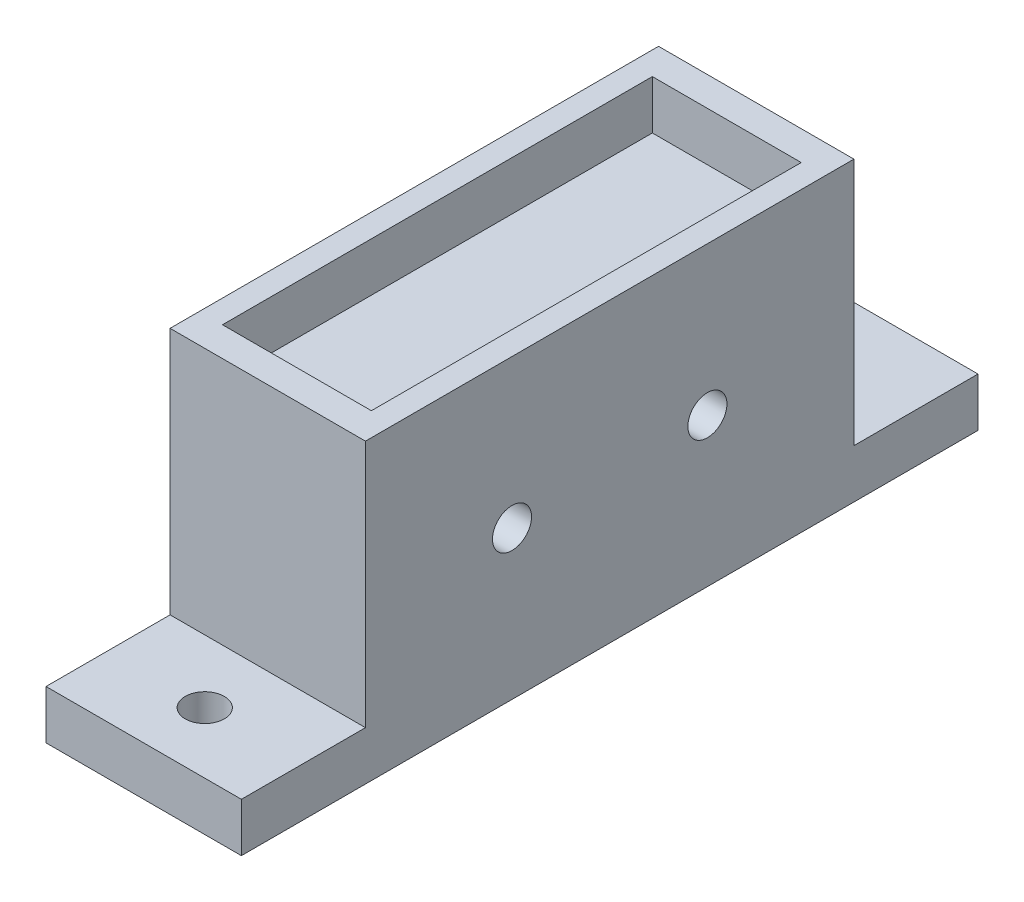
ISO-10303-21;
HEADER;
FILE_DESCRIPTION(('STEP AP214'),'2;1');
FILE_NAME('part.step','',(''),(''),'','','');
FILE_SCHEMA(('AUTOMOTIVE_DESIGN { 1 0 10303 214 1 1 1 1 }'));
ENDSEC;
DATA;
#1=APPLICATION_CONTEXT('core data for automotive mechanical design processes');
#2=APPLICATION_PROTOCOL_DEFINITION('international standard','automotive_design',2000,#1);
#3=PRODUCT_CONTEXT('',#1,'mechanical');
#4=PRODUCT('Part','Part','',(#3));
#5=PRODUCT_RELATED_PRODUCT_CATEGORY('part','',(#4));
#6=PRODUCT_DEFINITION_FORMATION('','',#4);
#7=PRODUCT_DEFINITION_CONTEXT('part definition',#1,'design');
#8=PRODUCT_DEFINITION('design','',#6,#7);
#9=PRODUCT_DEFINITION_SHAPE('','',#8);
#10=(LENGTH_UNIT() NAMED_UNIT(*) SI_UNIT(.MILLI.,.METRE.));
#11=(NAMED_UNIT(*) PLANE_ANGLE_UNIT() SI_UNIT($,.RADIAN.));
#12=(NAMED_UNIT(*) SI_UNIT($,.STERADIAN.) SOLID_ANGLE_UNIT());
#13=UNCERTAINTY_MEASURE_WITH_UNIT(LENGTH_MEASURE(1.E-05),#10,'distance_accuracy_value','');
#14=(GEOMETRIC_REPRESENTATION_CONTEXT(3) GLOBAL_UNCERTAINTY_ASSIGNED_CONTEXT((#13)) GLOBAL_UNIT_ASSIGNED_CONTEXT((#10,
#11,#12)) REPRESENTATION_CONTEXT('',''));
#15=CARTESIAN_POINT('',(0.,0.,0.));
#16=DIRECTION('',(0.,0.,1.));
#17=DIRECTION('',(1.,0.,0.));
#18=AXIS2_PLACEMENT_3D('',#15,#16,#17);
#19=CARTESIAN_POINT('',(20.,0.,-75.4));
#20=DIRECTION('',(0.,1.,0.));
#21=DIRECTION('',(0.,0.,1.));
#22=AXIS2_PLACEMENT_3D('',#19,#20,#21);
#23=PLANE('',#22);
#24=CARTESIAN_POINT('',(10.,0.,-69.15));
#25=DIRECTION('',(0.,1.,0.));
#26=DIRECTION('',(0.,0.,1.));
#27=AXIS2_PLACEMENT_3D('',#24,#25,#26);
#28=CIRCLE('',#27,2.);
#29=CARTESIAN_POINT('',(10.,0.,-67.15));
#30=VERTEX_POINT('',#29);
#31=EDGE_CURVE('E184',#30,#30,#28,.T.);
#32=ORIENTED_EDGE('',*,*,#31,.T.);
#33=EDGE_LOOP('',(#32));
#34=FACE_BOUND('',#33,.T.);
#35=CARTESIAN_POINT('',(10.,0.,-6.25000000000001));
#36=DIRECTION('',(0.,1.,0.));
#37=DIRECTION('',(0.,0.,1.));
#38=AXIS2_PLACEMENT_3D('',#35,#36,#37);
#39=CIRCLE('',#38,2.);
#40=CARTESIAN_POINT('',(10.,0.,-4.25000000000001));
#41=VERTEX_POINT('',#40);
#42=EDGE_CURVE('E190',#41,#41,#39,.T.);
#43=ORIENTED_EDGE('',*,*,#42,.T.);
#44=EDGE_LOOP('',(#43));
#45=FACE_BOUND('',#44,.T.);
#46=DIRECTION('',(0.,0.,-1.));
#47=VECTOR('',#46,1.);
#48=CARTESIAN_POINT('',(0.,0.,-75.4));
#49=LINE('',#48,#47);
#50=CARTESIAN_POINT('',(0.,0.,0.));
#51=VERTEX_POINT('',#50);
#52=CARTESIAN_POINT('',(0.,0.,-75.4));
#53=VERTEX_POINT('',#52);
#54=EDGE_CURVE('E142',#51,#53,#49,.T.);
#55=ORIENTED_EDGE('',*,*,#54,.T.);
#56=DIRECTION('',(-1.,0.,0.));
#57=VECTOR('',#56,1.);
#58=CARTESIAN_POINT('',(20.,0.,-75.4));
#59=LINE('',#58,#57);
#60=CARTESIAN_POINT('',(20.,0.,-75.4));
#61=VERTEX_POINT('',#60);
#62=EDGE_CURVE('E11',#61,#53,#59,.T.);
#63=ORIENTED_EDGE('',*,*,#62,.F.);
#64=DIRECTION('',(0.,0.,-1.));
#65=VECTOR('',#64,1.);
#66=CARTESIAN_POINT('',(20.,0.,-75.4));
#67=LINE('',#66,#65);
#68=CARTESIAN_POINT('',(20.,0.,0.));
#69=VERTEX_POINT('',#68);
#70=EDGE_CURVE('E158',#69,#61,#67,.T.);
#71=ORIENTED_EDGE('',*,*,#70,.F.);
#72=DIRECTION('',(-1.,0.,0.));
#73=VECTOR('',#72,1.);
#74=CARTESIAN_POINT('',(20.,0.,0.));
#75=LINE('',#74,#73);
#76=EDGE_CURVE('E138',#69,#51,#75,.T.);
#77=ORIENTED_EDGE('',*,*,#76,.T.);
#78=EDGE_LOOP('',(#55,#63,#71,#77));
#79=FACE_BOUND('',#78,.T.);
#80=ADVANCED_FACE('F32',(#34,#45,#79),#23,.F.);
#81=CARTESIAN_POINT('',(20.,5.,-75.4));
#82=DIRECTION('',(0.,0.,1.));
#83=DIRECTION('',(1.,0.,0.));
#84=AXIS2_PLACEMENT_3D('',#81,#82,#83);
#85=PLANE('',#84);
#86=DIRECTION('',(0.,1.,0.));
#87=VECTOR('',#86,1.);
#88=CARTESIAN_POINT('',(0.,5.,-75.4));
#89=LINE('',#88,#87);
#90=CARTESIAN_POINT('',(0.,5.,-75.4));
#91=VERTEX_POINT('',#90);
#92=EDGE_CURVE('E145',#53,#91,#89,.T.);
#93=ORIENTED_EDGE('',*,*,#92,.T.);
#94=DIRECTION('',(-1.,0.,0.));
#95=VECTOR('',#94,1.);
#96=CARTESIAN_POINT('',(20.,5.,-75.4));
#97=LINE('',#96,#95);
#98=CARTESIAN_POINT('',(20.,5.,-75.4));
#99=VERTEX_POINT('',#98);
#100=EDGE_CURVE('E40',#99,#91,#97,.T.);
#101=ORIENTED_EDGE('',*,*,#100,.F.);
#102=DIRECTION('',(0.,1.,0.));
#103=VECTOR('',#102,1.);
#104=CARTESIAN_POINT('',(20.,5.,-75.4));
#105=LINE('',#104,#103);
#106=EDGE_CURVE('E98',#61,#99,#105,.T.);
#107=ORIENTED_EDGE('',*,*,#106,.F.);
#108=ORIENTED_EDGE('',*,*,#62,.T.);
#109=EDGE_LOOP('',(#93,#101,#107,#108));
#110=FACE_BOUND('',#109,.T.);
#111=ADVANCED_FACE('F248',(#110),#85,.F.);
#112=CARTESIAN_POINT('',(20.,5.,-62.7));
#113=DIRECTION('',(0.,-1.,0.));
#114=DIRECTION('',(0.,0.,-1.));
#115=AXIS2_PLACEMENT_3D('',#112,#113,#114);
#116=PLANE('',#115);
#117=CARTESIAN_POINT('',(10.,5.,-69.15));
#118=DIRECTION('',(0.,1.,0.));
#119=DIRECTION('',(0.,0.,1.));
#120=AXIS2_PLACEMENT_3D('',#117,#118,#119);
#121=CIRCLE('',#120,2.);
#122=CARTESIAN_POINT('',(10.,5.,-67.15));
#123=VERTEX_POINT('',#122);
#124=EDGE_CURVE('E187',#123,#123,#121,.T.);
#125=ORIENTED_EDGE('',*,*,#124,.F.);
#126=EDGE_LOOP('',(#125));
#127=FACE_BOUND('',#126,.T.);
#128=DIRECTION('',(0.,0.,1.));
#129=VECTOR('',#128,1.);
#130=CARTESIAN_POINT('',(0.,5.,-62.7));
#131=LINE('',#130,#129);
#132=CARTESIAN_POINT('',(0.,5.,-62.7));
#133=VERTEX_POINT('',#132);
#134=EDGE_CURVE('E148',#91,#133,#131,.T.);
#135=ORIENTED_EDGE('',*,*,#134,.T.);
#136=DIRECTION('',(-1.,0.,0.));
#137=VECTOR('',#136,1.);
#138=CARTESIAN_POINT('',(20.,5.,-62.7));
#139=LINE('',#138,#137);
#140=CARTESIAN_POINT('',(20.,5.,-62.7));
#141=VERTEX_POINT('',#140);
#142=EDGE_CURVE('E165',#141,#133,#139,.T.);
#143=ORIENTED_EDGE('',*,*,#142,.F.);
#144=DIRECTION('',(0.,0.,1.));
#145=VECTOR('',#144,1.);
#146=CARTESIAN_POINT('',(20.,5.,-62.7));
#147=LINE('',#146,#145);
#148=EDGE_CURVE('E228',#99,#141,#147,.T.);
#149=ORIENTED_EDGE('',*,*,#148,.F.);
#150=ORIENTED_EDGE('',*,*,#100,.T.);
#151=EDGE_LOOP('',(#135,#143,#149,#150));
#152=FACE_BOUND('',#151,.T.);
#153=ADVANCED_FACE('F251',(#127,#152),#116,.F.);
#154=CARTESIAN_POINT('',(20.,30.4,-62.7));
#155=DIRECTION('',(0.,0.,1.));
#156=DIRECTION('',(1.,0.,0.));
#157=AXIS2_PLACEMENT_3D('',#154,#155,#156);
#158=PLANE('',#157);
#159=DIRECTION('',(0.,1.,0.));
#160=VECTOR('',#159,1.);
#161=CARTESIAN_POINT('',(0.,30.4,-62.7));
#162=LINE('',#161,#160);
#163=CARTESIAN_POINT('',(0.,30.4,-62.7));
#164=VERTEX_POINT('',#163);
#165=EDGE_CURVE('E150',#133,#164,#162,.T.);
#166=ORIENTED_EDGE('',*,*,#165,.T.);
#167=DIRECTION('',(-1.,0.,0.));
#168=VECTOR('',#167,1.);
#169=CARTESIAN_POINT('',(20.,30.4,-62.7));
#170=LINE('',#169,#168);
#171=CARTESIAN_POINT('',(20.,30.4,-62.7));
#172=VERTEX_POINT('',#171);
#173=EDGE_CURVE('E162',#172,#164,#170,.T.);
#174=ORIENTED_EDGE('',*,*,#173,.F.);
#175=DIRECTION('',(0.,1.,0.));
#176=VECTOR('',#175,1.);
#177=CARTESIAN_POINT('',(20.,30.4,-62.7));
#178=LINE('',#177,#176);
#179=EDGE_CURVE('E230',#141,#172,#178,.T.);
#180=ORIENTED_EDGE('',*,*,#179,.F.);
#181=ORIENTED_EDGE('',*,*,#142,.T.);
#182=EDGE_LOOP('',(#166,#174,#180,#181));
#183=FACE_BOUND('',#182,.T.);
#184=ADVANCED_FACE('F236',(#183),#158,.F.);
#185=CARTESIAN_POINT('',(20.,30.4,-12.7));
#186=DIRECTION('',(0.,-1.,0.));
#187=DIRECTION('',(0.,0.,-1.));
#188=AXIS2_PLACEMENT_3D('',#185,#186,#187);
#189=PLANE('',#188);
#190=DIRECTION('',(-1.,0.,0.));
#191=VECTOR('',#190,1.);
#192=CARTESIAN_POINT('',(2.36641600949149,30.4,-59.7));
#193=LINE('',#192,#191);
#194=CARTESIAN_POINT('',(17.6064160094915,30.4,-59.7));
#195=VERTEX_POINT('',#194);
#196=CARTESIAN_POINT('',(2.36641600949149,30.4,-59.7));
#197=VERTEX_POINT('',#196);
#198=EDGE_CURVE('E210',#195,#197,#193,.T.);
#199=ORIENTED_EDGE('',*,*,#198,.F.);
#200=DIRECTION('',(0.,0.,-1.));
#201=VECTOR('',#200,1.);
#202=CARTESIAN_POINT('',(17.6064160094915,30.4,-59.7));
#203=LINE('',#202,#201);
#204=CARTESIAN_POINT('',(17.6064160094915,30.4,-15.7));
#205=VERTEX_POINT('',#204);
#206=EDGE_CURVE('E48',#205,#195,#203,.T.);
#207=ORIENTED_EDGE('',*,*,#206,.F.);
#208=DIRECTION('',(1.,0.,0.));
#209=VECTOR('',#208,1.);
#210=CARTESIAN_POINT('',(2.36641600949149,30.4,-15.7));
#211=LINE('',#210,#209);
#212=CARTESIAN_POINT('',(2.36641600949149,30.4,-15.7));
#213=VERTEX_POINT('',#212);
#214=EDGE_CURVE('E199',#213,#205,#211,.T.);
#215=ORIENTED_EDGE('',*,*,#214,.F.);
#216=DIRECTION('',(0.,0.,1.));
#217=VECTOR('',#216,1.);
#218=CARTESIAN_POINT('',(2.36641600949149,30.4,-59.7));
#219=LINE('',#218,#217);
#220=EDGE_CURVE('E213',#197,#213,#219,.T.);
#221=ORIENTED_EDGE('',*,*,#220,.F.);
#222=EDGE_LOOP('',(#199,#207,#215,#221));
#223=FACE_BOUND('',#222,.T.);
#224=DIRECTION('',(0.,0.,1.));
#225=VECTOR('',#224,1.);
#226=CARTESIAN_POINT('',(0.,30.4,-12.7));
#227=LINE('',#226,#225);
#228=CARTESIAN_POINT('',(0.,30.4,-12.7));
#229=VERTEX_POINT('',#228);
#230=EDGE_CURVE('E152',#164,#229,#227,.T.);
#231=ORIENTED_EDGE('',*,*,#230,.T.);
#232=DIRECTION('',(-1.,0.,0.));
#233=VECTOR('',#232,1.);
#234=CARTESIAN_POINT('',(20.,30.4,-12.7));
#235=LINE('',#234,#233);
#236=CARTESIAN_POINT('',(20.,30.4,-12.7));
#237=VERTEX_POINT('',#236);
#238=EDGE_CURVE('E133',#237,#229,#235,.T.);
#239=ORIENTED_EDGE('',*,*,#238,.F.);
#240=DIRECTION('',(0.,0.,1.));
#241=VECTOR('',#240,1.);
#242=CARTESIAN_POINT('',(20.,30.4,-12.7));
#243=LINE('',#242,#241);
#244=EDGE_CURVE('E121',#172,#237,#243,.T.);
#245=ORIENTED_EDGE('',*,*,#244,.F.);
#246=ORIENTED_EDGE('',*,*,#173,.T.);
#247=EDGE_LOOP('',(#231,#239,#245,#246));
#248=FACE_BOUND('',#247,.T.);
#249=ADVANCED_FACE('F240',(#223,#248),#189,.F.);
#250=CARTESIAN_POINT('',(20.,5.,-12.7));
#251=DIRECTION('',(0.,0.,-1.));
#252=DIRECTION('',(-1.,0.,0.));
#253=AXIS2_PLACEMENT_3D('',#250,#251,#252);
#254=PLANE('',#253);
#255=DIRECTION('',(0.,-1.,0.));
#256=VECTOR('',#255,1.);
#257=CARTESIAN_POINT('',(0.,5.,-12.7));
#258=LINE('',#257,#256);
#259=CARTESIAN_POINT('',(0.,5.,-12.7));
#260=VERTEX_POINT('',#259);
#261=EDGE_CURVE('E130',#229,#260,#258,.T.);
#262=ORIENTED_EDGE('',*,*,#261,.T.);
#263=DIRECTION('',(-1.,0.,0.));
#264=VECTOR('',#263,1.);
#265=CARTESIAN_POINT('',(20.,5.,-12.7));
#266=LINE('',#265,#264);
#267=CARTESIAN_POINT('',(20.,5.,-12.7));
#268=VERTEX_POINT('',#267);
#269=EDGE_CURVE('E127',#268,#260,#266,.T.);
#270=ORIENTED_EDGE('',*,*,#269,.F.);
#271=DIRECTION('',(0.,-1.,0.));
#272=VECTOR('',#271,1.);
#273=CARTESIAN_POINT('',(20.,5.,-12.7));
#274=LINE('',#273,#272);
#275=EDGE_CURVE('E114',#237,#268,#274,.T.);
#276=ORIENTED_EDGE('',*,*,#275,.F.);
#277=ORIENTED_EDGE('',*,*,#238,.T.);
#278=EDGE_LOOP('',(#262,#270,#276,#277));
#279=FACE_BOUND('',#278,.T.);
#280=ADVANCED_FACE('F128',(#279),#254,.F.);
#281=CARTESIAN_POINT('',(20.,5.,0.));
#282=DIRECTION('',(0.,-1.,0.));
#283=DIRECTION('',(0.,0.,-1.));
#284=AXIS2_PLACEMENT_3D('',#281,#282,#283);
#285=PLANE('',#284);
#286=CARTESIAN_POINT('',(10.,5.,-6.25000000000001));
#287=DIRECTION('',(0.,1.,0.));
#288=DIRECTION('',(0.,0.,1.));
#289=AXIS2_PLACEMENT_3D('',#286,#287,#288);
#290=CIRCLE('',#289,2.);
#291=CARTESIAN_POINT('',(10.,5.,-4.25000000000001));
#292=VERTEX_POINT('',#291);
#293=EDGE_CURVE('E175',#292,#292,#290,.T.);
#294=ORIENTED_EDGE('',*,*,#293,.F.);
#295=EDGE_LOOP('',(#294));
#296=FACE_BOUND('',#295,.T.);
#297=DIRECTION('',(0.,0.,1.));
#298=VECTOR('',#297,1.);
#299=CARTESIAN_POINT('',(0.,5.,0.));
#300=LINE('',#299,#298);
#301=CARTESIAN_POINT('',(0.,5.,0.));
#302=VERTEX_POINT('',#301);
#303=EDGE_CURVE('E155',#260,#302,#300,.T.);
#304=ORIENTED_EDGE('',*,*,#303,.T.);
#305=DIRECTION('',(-1.,0.,0.));
#306=VECTOR('',#305,1.);
#307=CARTESIAN_POINT('',(20.,5.,0.));
#308=LINE('',#307,#306);
#309=CARTESIAN_POINT('',(20.,5.,0.));
#310=VERTEX_POINT('',#309);
#311=EDGE_CURVE('E134',#310,#302,#308,.T.);
#312=ORIENTED_EDGE('',*,*,#311,.F.);
#313=DIRECTION('',(0.,0.,1.));
#314=VECTOR('',#313,1.);
#315=CARTESIAN_POINT('',(20.,5.,0.));
#316=LINE('',#315,#314);
#317=EDGE_CURVE('E118',#268,#310,#316,.T.);
#318=ORIENTED_EDGE('',*,*,#317,.F.);
#319=ORIENTED_EDGE('',*,*,#269,.T.);
#320=EDGE_LOOP('',(#304,#312,#318,#319));
#321=FACE_BOUND('',#320,.T.);
#322=ADVANCED_FACE('F136',(#296,#321),#285,.F.);
#323=CARTESIAN_POINT('',(20.,0.,0.));
#324=DIRECTION('',(0.,0.,-1.));
#325=DIRECTION('',(-1.,0.,0.));
#326=AXIS2_PLACEMENT_3D('',#323,#324,#325);
#327=PLANE('',#326);
#328=DIRECTION('',(0.,-1.,0.));
#329=VECTOR('',#328,1.);
#330=CARTESIAN_POINT('',(0.,0.,0.));
#331=LINE('',#330,#329);
#332=EDGE_CURVE('E90',#302,#51,#331,.T.);
#333=ORIENTED_EDGE('',*,*,#332,.T.);
#334=ORIENTED_EDGE('',*,*,#76,.F.);
#335=DIRECTION('',(0.,-1.,0.));
#336=VECTOR('',#335,1.);
#337=CARTESIAN_POINT('',(20.,0.,0.));
#338=LINE('',#337,#336);
#339=EDGE_CURVE('E57',#310,#69,#338,.T.);
#340=ORIENTED_EDGE('',*,*,#339,.F.);
#341=ORIENTED_EDGE('',*,*,#311,.T.);
#342=EDGE_LOOP('',(#333,#334,#340,#341));
#343=FACE_BOUND('',#342,.T.);
#344=ADVANCED_FACE('F244',(#343),#327,.F.);
#345=CARTESIAN_POINT('',(20.,0.,0.));
#346=DIRECTION('',(-1.,0.,0.));
#347=DIRECTION('',(0.,0.,1.));
#348=AXIS2_PLACEMENT_3D('',#345,#346,#347);
#349=PLANE('',#348);
#350=CARTESIAN_POINT('',(20.,15.2,-27.7));
#351=DIRECTION('',(1.,0.,0.));
#352=DIRECTION('',(0.,0.,-1.));
#353=AXIS2_PLACEMENT_3D('',#350,#351,#352);
#354=CIRCLE('',#353,2.);
#355=CARTESIAN_POINT('',(20.,15.2,-29.7));
#356=VERTEX_POINT('',#355);
#357=EDGE_CURVE('E171',#356,#356,#354,.T.);
#358=ORIENTED_EDGE('',*,*,#357,.F.);
#359=EDGE_LOOP('',(#358));
#360=FACE_BOUND('',#359,.T.);
#361=CARTESIAN_POINT('',(20.,15.2,-47.7));
#362=DIRECTION('',(1.,0.,0.));
#363=DIRECTION('',(0.,0.,-1.));
#364=AXIS2_PLACEMENT_3D('',#361,#362,#363);
#365=CIRCLE('',#364,2.);
#366=CARTESIAN_POINT('',(20.,15.2,-49.7));
#367=VERTEX_POINT('',#366);
#368=EDGE_CURVE('E177',#367,#367,#365,.T.);
#369=ORIENTED_EDGE('',*,*,#368,.F.);
#370=EDGE_LOOP('',(#369));
#371=FACE_BOUND('',#370,.T.);
#372=ORIENTED_EDGE('',*,*,#70,.T.);
#373=ORIENTED_EDGE('',*,*,#106,.T.);
#374=ORIENTED_EDGE('',*,*,#148,.T.);
#375=ORIENTED_EDGE('',*,*,#179,.T.);
#376=ORIENTED_EDGE('',*,*,#244,.T.);
#377=ORIENTED_EDGE('',*,*,#275,.T.);
#378=ORIENTED_EDGE('',*,*,#317,.T.);
#379=ORIENTED_EDGE('',*,*,#339,.T.);
#380=EDGE_LOOP('',(#372,#373,#374,#375,#376,#377,#378,#379));
#381=FACE_BOUND('',#380,.T.);
#382=ADVANCED_FACE('F116',(#360,#371,#381),#349,.F.);
#383=CARTESIAN_POINT('',(0.,0.,0.));
#384=DIRECTION('',(-1.,0.,0.));
#385=DIRECTION('',(0.,0.,1.));
#386=AXIS2_PLACEMENT_3D('',#383,#384,#385);
#387=PLANE('',#386);
#388=CARTESIAN_POINT('',(0.,15.2,-27.7));
#389=DIRECTION('',(-1.,0.,0.));
#390=DIRECTION('',(0.,0.,1.));
#391=AXIS2_PLACEMENT_3D('',#388,#389,#390);
#392=CIRCLE('',#391,2.);
#393=CARTESIAN_POINT('',(0.,15.2,-25.7));
#394=VERTEX_POINT('',#393);
#395=EDGE_CURVE('E35',#394,#394,#392,.F.);
#396=ORIENTED_EDGE('',*,*,#395,.T.);
#397=EDGE_LOOP('',(#396));
#398=FACE_BOUND('',#397,.T.);
#399=CARTESIAN_POINT('',(0.,15.2,-47.7));
#400=DIRECTION('',(-1.,0.,0.));
#401=DIRECTION('',(0.,0.,1.));
#402=AXIS2_PLACEMENT_3D('',#399,#400,#401);
#403=CIRCLE('',#402,2.);
#404=CARTESIAN_POINT('',(0.,15.2,-45.7));
#405=VERTEX_POINT('',#404);
#406=EDGE_CURVE('E169',#405,#405,#403,.F.);
#407=ORIENTED_EDGE('',*,*,#406,.T.);
#408=EDGE_LOOP('',(#407));
#409=FACE_BOUND('',#408,.T.);
#410=ORIENTED_EDGE('',*,*,#54,.F.);
#411=ORIENTED_EDGE('',*,*,#332,.F.);
#412=ORIENTED_EDGE('',*,*,#303,.F.);
#413=ORIENTED_EDGE('',*,*,#261,.F.);
#414=ORIENTED_EDGE('',*,*,#230,.F.);
#415=ORIENTED_EDGE('',*,*,#165,.F.);
#416=ORIENTED_EDGE('',*,*,#134,.F.);
#417=ORIENTED_EDGE('',*,*,#92,.F.);
#418=EDGE_LOOP('',(#410,#411,#412,#413,#414,#415,#416,#417));
#419=FACE_BOUND('',#418,.T.);
#420=ADVANCED_FACE('F243',(#398,#409,#419),#387,.T.);
#421=CARTESIAN_POINT('',(17.6064160094915,25.4,-59.7));
#422=DIRECTION('',(1.,0.,0.));
#423=DIRECTION('',(0.,0.,-1.));
#424=AXIS2_PLACEMENT_3D('',#421,#422,#423);
#425=PLANE('',#424);
#426=ORIENTED_EDGE('',*,*,#206,.T.);
#427=DIRECTION('',(0.,1.,0.));
#428=VECTOR('',#427,1.);
#429=CARTESIAN_POINT('',(17.6064160094915,25.4,-59.7));
#430=LINE('',#429,#428);
#431=CARTESIAN_POINT('',(17.6064160094915,25.4,-59.7));
#432=VERTEX_POINT('',#431);
#433=EDGE_CURVE('E208',#432,#195,#430,.T.);
#434=ORIENTED_EDGE('',*,*,#433,.F.);
#435=DIRECTION('',(0.,0.,-1.));
#436=VECTOR('',#435,1.);
#437=CARTESIAN_POINT('',(17.6064160094915,25.4,-59.7));
#438=LINE('',#437,#436);
#439=CARTESIAN_POINT('',(17.6064160094915,25.4,-15.7));
#440=VERTEX_POINT('',#439);
#441=EDGE_CURVE('E195',#440,#432,#438,.T.);
#442=ORIENTED_EDGE('',*,*,#441,.F.);
#443=DIRECTION('',(0.,1.,0.));
#444=VECTOR('',#443,1.);
#445=CARTESIAN_POINT('',(17.6064160094915,25.4,-15.7));
#446=LINE('',#445,#444);
#447=EDGE_CURVE('E146',#440,#205,#446,.T.);
#448=ORIENTED_EDGE('',*,*,#447,.T.);
#449=EDGE_LOOP('',(#426,#434,#442,#448));
#450=FACE_BOUND('',#449,.T.);
#451=ADVANCED_FACE('F313',(#450),#425,.F.);
#452=CARTESIAN_POINT('',(2.36641600949149,25.4,-15.7));
#453=DIRECTION('',(0.,0.,1.));
#454=DIRECTION('',(1.,0.,0.));
#455=AXIS2_PLACEMENT_3D('',#452,#453,#454);
#456=PLANE('',#455);
#457=ORIENTED_EDGE('',*,*,#214,.T.);
#458=ORIENTED_EDGE('',*,*,#447,.F.);
#459=DIRECTION('',(1.,0.,0.));
#460=VECTOR('',#459,1.);
#461=CARTESIAN_POINT('',(2.36641600949149,25.4,-15.7));
#462=LINE('',#461,#460);
#463=CARTESIAN_POINT('',(2.36641600949149,25.4,-15.7));
#464=VERTEX_POINT('',#463);
#465=EDGE_CURVE('E205',#464,#440,#462,.T.);
#466=ORIENTED_EDGE('',*,*,#465,.F.);
#467=DIRECTION('',(0.,1.,0.));
#468=VECTOR('',#467,1.);
#469=CARTESIAN_POINT('',(2.36641600949149,25.4,-15.7));
#470=LINE('',#469,#468);
#471=EDGE_CURVE('E219',#464,#213,#470,.T.);
#472=ORIENTED_EDGE('',*,*,#471,.T.);
#473=EDGE_LOOP('',(#457,#458,#466,#472));
#474=FACE_BOUND('',#473,.T.);
#475=ADVANCED_FACE('F316',(#474),#456,.F.);
#476=CARTESIAN_POINT('',(2.36641600949149,25.4,-59.7));
#477=DIRECTION('',(-1.,0.,0.));
#478=DIRECTION('',(0.,0.,1.));
#479=AXIS2_PLACEMENT_3D('',#476,#477,#478);
#480=PLANE('',#479);
#481=ORIENTED_EDGE('',*,*,#220,.T.);
#482=ORIENTED_EDGE('',*,*,#471,.F.);
#483=DIRECTION('',(0.,0.,1.));
#484=VECTOR('',#483,1.);
#485=CARTESIAN_POINT('',(2.36641600949149,25.4,-59.7));
#486=LINE('',#485,#484);
#487=CARTESIAN_POINT('',(2.36641600949149,25.4,-59.7));
#488=VERTEX_POINT('',#487);
#489=EDGE_CURVE('E202',#488,#464,#486,.T.);
#490=ORIENTED_EDGE('',*,*,#489,.F.);
#491=DIRECTION('',(0.,1.,0.));
#492=VECTOR('',#491,1.);
#493=CARTESIAN_POINT('',(2.36641600949149,25.4,-59.7));
#494=LINE('',#493,#492);
#495=EDGE_CURVE('E222',#488,#197,#494,.T.);
#496=ORIENTED_EDGE('',*,*,#495,.T.);
#497=EDGE_LOOP('',(#481,#482,#490,#496));
#498=FACE_BOUND('',#497,.T.);
#499=ADVANCED_FACE('F317',(#498),#480,.F.);
#500=CARTESIAN_POINT('',(2.36641600949149,25.4,-59.7));
#501=DIRECTION('',(0.,0.,-1.));
#502=DIRECTION('',(-1.,0.,0.));
#503=AXIS2_PLACEMENT_3D('',#500,#501,#502);
#504=PLANE('',#503);
#505=ORIENTED_EDGE('',*,*,#198,.T.);
#506=ORIENTED_EDGE('',*,*,#495,.F.);
#507=DIRECTION('',(-1.,0.,0.));
#508=VECTOR('',#507,1.);
#509=CARTESIAN_POINT('',(2.36641600949149,25.4,-59.7));
#510=LINE('',#509,#508);
#511=EDGE_CURVE('E198',#432,#488,#510,.T.);
#512=ORIENTED_EDGE('',*,*,#511,.F.);
#513=ORIENTED_EDGE('',*,*,#433,.T.);
#514=EDGE_LOOP('',(#505,#506,#512,#513));
#515=FACE_BOUND('',#514,.T.);
#516=ADVANCED_FACE('F297',(#515),#504,.F.);
#517=CARTESIAN_POINT('',(0.,25.4,0.));
#518=DIRECTION('',(0.,1.,0.));
#519=DIRECTION('',(0.,0.,1.));
#520=AXIS2_PLACEMENT_3D('',#517,#518,#519);
#521=PLANE('',#520);
#522=ORIENTED_EDGE('',*,*,#441,.T.);
#523=ORIENTED_EDGE('',*,*,#511,.T.);
#524=ORIENTED_EDGE('',*,*,#489,.T.);
#525=ORIENTED_EDGE('',*,*,#465,.T.);
#526=EDGE_LOOP('',(#522,#523,#524,#525));
#527=FACE_BOUND('',#526,.T.);
#528=ADVANCED_FACE('F273',(#527),#521,.T.);
#529=CARTESIAN_POINT('',(10.,0.,-6.25000000000001));
#530=DIRECTION('',(0.,1.,0.));
#531=DIRECTION('',(0.,0.,1.));
#532=AXIS2_PLACEMENT_3D('',#529,#530,#531);
#533=CYLINDRICAL_SURFACE('',#532,2.);
#534=ORIENTED_EDGE('',*,*,#42,.F.);
#535=EDGE_LOOP('',(#534));
#536=FACE_BOUND('',#535,.T.);
#537=ORIENTED_EDGE('',*,*,#293,.T.);
#538=EDGE_LOOP('',(#537));
#539=FACE_BOUND('',#538,.T.);
#540=ADVANCED_FACE('F269',(#536,#539),#533,.F.);
#541=CARTESIAN_POINT('',(10.,0.,-69.15));
#542=DIRECTION('',(0.,1.,0.));
#543=DIRECTION('',(0.,0.,1.));
#544=AXIS2_PLACEMENT_3D('',#541,#542,#543);
#545=CYLINDRICAL_SURFACE('',#544,2.);
#546=ORIENTED_EDGE('',*,*,#31,.F.);
#547=EDGE_LOOP('',(#546));
#548=FACE_BOUND('',#547,.T.);
#549=ORIENTED_EDGE('',*,*,#124,.T.);
#550=EDGE_LOOP('',(#549));
#551=FACE_BOUND('',#550,.T.);
#552=ADVANCED_FACE('F272',(#548,#551),#545,.F.);
#553=CARTESIAN_POINT('',(20.,15.2,-47.7));
#554=DIRECTION('',(-1.,0.,0.));
#555=DIRECTION('',(0.,0.,1.));
#556=AXIS2_PLACEMENT_3D('',#553,#554,#555);
#557=CYLINDRICAL_SURFACE('',#556,2.);
#558=ORIENTED_EDGE('',*,*,#406,.F.);
#559=EDGE_LOOP('',(#558));
#560=FACE_BOUND('',#559,.T.);
#561=ORIENTED_EDGE('',*,*,#368,.T.);
#562=EDGE_LOOP('',(#561));
#563=FACE_BOUND('',#562,.T.);
#564=ADVANCED_FACE('F340',(#560,#563),#557,.F.);
#565=CARTESIAN_POINT('',(20.,15.2,-27.7));
#566=DIRECTION('',(-1.,0.,0.));
#567=DIRECTION('',(0.,0.,1.));
#568=AXIS2_PLACEMENT_3D('',#565,#566,#567);
#569=CYLINDRICAL_SURFACE('',#568,2.);
#570=ORIENTED_EDGE('',*,*,#395,.F.);
#571=EDGE_LOOP('',(#570));
#572=FACE_BOUND('',#571,.T.);
#573=ORIENTED_EDGE('',*,*,#357,.T.);
#574=EDGE_LOOP('',(#573));
#575=FACE_BOUND('',#574,.T.);
#576=ADVANCED_FACE('F338',(#572,#575),#569,.F.);
#577=CLOSED_SHELL('',(#80,#111,#153,#184,#249,#280,#322,#344,#382,#420,#451,#475,#499,#516,#528,
#540,#552,#564,#576));
#578=MANIFOLD_SOLID_BREP('B2',#577);
#579=ADVANCED_BREP_SHAPE_REPRESENTATION('',(#18,#578),#14);
#580=SHAPE_DEFINITION_REPRESENTATION(#9,#579);
ENDSEC;
END-ISO-10303-21;
